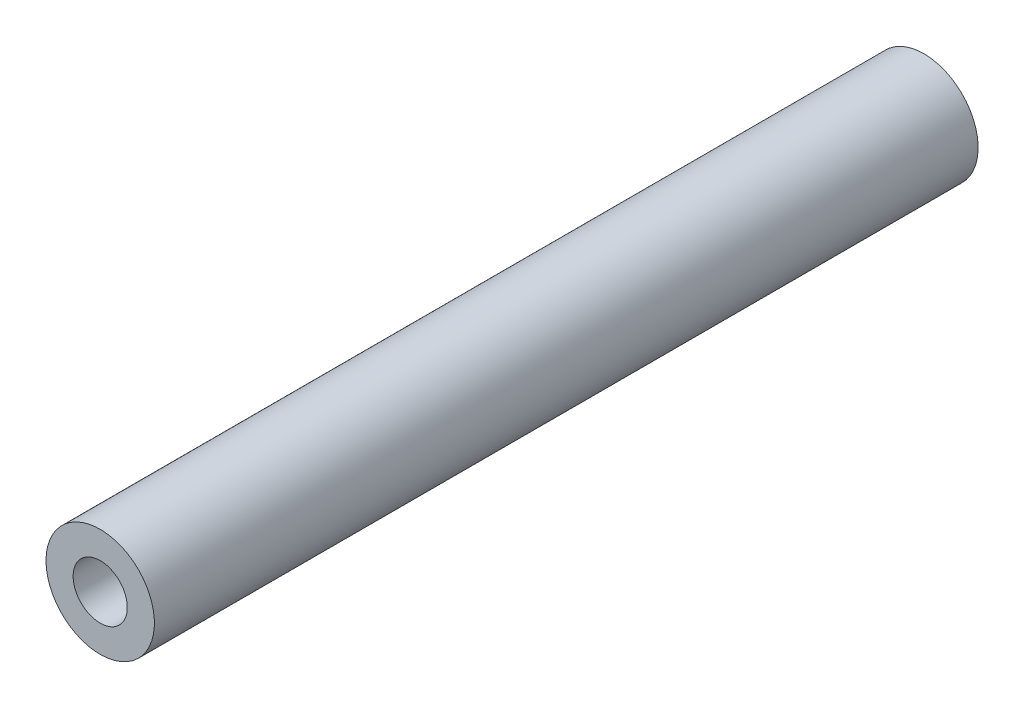
ISO-10303-21;
HEADER;
FILE_DESCRIPTION(('STEP AP214'),'2;1');
FILE_NAME('part.step','',(''),(''),'','','');
FILE_SCHEMA(('AUTOMOTIVE_DESIGN { 1 0 10303 214 1 1 1 1 }'));
ENDSEC;
DATA;
#1=APPLICATION_CONTEXT('core data for automotive mechanical design processes');
#2=APPLICATION_PROTOCOL_DEFINITION('international standard','automotive_design',2000,#1);
#3=PRODUCT_CONTEXT('',#1,'mechanical');
#4=PRODUCT('Part','Part','',(#3));
#5=PRODUCT_RELATED_PRODUCT_CATEGORY('part','',(#4));
#6=PRODUCT_DEFINITION_FORMATION('','',#4);
#7=PRODUCT_DEFINITION_CONTEXT('part definition',#1,'design');
#8=PRODUCT_DEFINITION('design','',#6,#7);
#9=PRODUCT_DEFINITION_SHAPE('','',#8);
#10=(LENGTH_UNIT() NAMED_UNIT(*) SI_UNIT(.MILLI.,.METRE.));
#11=(NAMED_UNIT(*) PLANE_ANGLE_UNIT() SI_UNIT($,.RADIAN.));
#12=(NAMED_UNIT(*) SI_UNIT($,.STERADIAN.) SOLID_ANGLE_UNIT());
#13=UNCERTAINTY_MEASURE_WITH_UNIT(LENGTH_MEASURE(1.E-05),#10,'distance_accuracy_value','');
#14=(GEOMETRIC_REPRESENTATION_CONTEXT(3) GLOBAL_UNCERTAINTY_ASSIGNED_CONTEXT((#13)) GLOBAL_UNIT_ASSIGNED_CONTEXT((#10,
#11,#12)) REPRESENTATION_CONTEXT('',''));
#15=CARTESIAN_POINT('',(0.,0.,0.));
#16=DIRECTION('',(0.,0.,1.));
#17=DIRECTION('',(1.,0.,0.));
#18=AXIS2_PLACEMENT_3D('',#15,#16,#17);
#19=CARTESIAN_POINT('',(0.,0.,96.52));
#20=DIRECTION('',(0.,0.,1.));
#21=DIRECTION('',(1.,0.,0.));
#22=AXIS2_PLACEMENT_3D('',#19,#20,#21);
#23=PLANE('',#22);
#24=CARTESIAN_POINT('',(0.,0.,96.52));
#25=DIRECTION('',(0.,0.,1.));
#26=DIRECTION('',(1.,0.,0.));
#27=AXIS2_PLACEMENT_3D('',#24,#25,#26);
#28=CIRCLE('',#27,6.35);
#29=CARTESIAN_POINT('',(-6.35,0.,96.52));
#30=VERTEX_POINT('',#29);
#31=EDGE_CURVE('E10',#30,#30,#28,.T.);
#32=ORIENTED_EDGE('',*,*,#31,.T.);
#33=EDGE_LOOP('',(#32));
#34=FACE_BOUND('',#33,.T.);
#35=CARTESIAN_POINT('',(0.,0.,96.52));
#36=DIRECTION('',(0.,0.,1.));
#37=DIRECTION('',(1.,0.,0.));
#38=AXIS2_PLACEMENT_3D('',#35,#36,#37);
#39=CIRCLE('',#38,3.175);
#40=CARTESIAN_POINT('',(-3.175,0.,96.52));
#41=VERTEX_POINT('',#40);
#42=EDGE_CURVE('E42',#41,#41,#39,.T.);
#43=ORIENTED_EDGE('',*,*,#42,.F.);
#44=EDGE_LOOP('',(#43));
#45=FACE_BOUND('',#44,.T.);
#46=ADVANCED_FACE('F31',(#34,#45),#23,.T.);
#47=CARTESIAN_POINT('',(0.,0.,0.));
#48=DIRECTION('',(0.,0.,1.));
#49=DIRECTION('',(1.,0.,0.));
#50=AXIS2_PLACEMENT_3D('',#47,#48,#49);
#51=PLANE('',#50);
#52=CARTESIAN_POINT('',(0.,0.,0.));
#53=DIRECTION('',(0.,0.,1.));
#54=DIRECTION('',(1.,0.,0.));
#55=AXIS2_PLACEMENT_3D('',#52,#53,#54);
#56=CIRCLE('',#55,6.35);
#57=CARTESIAN_POINT('',(-6.35,0.,0.));
#58=VERTEX_POINT('',#57);
#59=EDGE_CURVE('E35',#58,#58,#56,.T.);
#60=ORIENTED_EDGE('',*,*,#59,.F.);
#61=EDGE_LOOP('',(#60));
#62=FACE_BOUND('',#61,.T.);
#63=CARTESIAN_POINT('',(0.,0.,0.));
#64=DIRECTION('',(0.,0.,1.));
#65=DIRECTION('',(1.,0.,0.));
#66=AXIS2_PLACEMENT_3D('',#63,#64,#65);
#67=CIRCLE('',#66,3.175);
#68=CARTESIAN_POINT('',(-3.175,0.,0.));
#69=VERTEX_POINT('',#68);
#70=EDGE_CURVE('E44',#69,#69,#67,.T.);
#71=ORIENTED_EDGE('',*,*,#70,.T.);
#72=EDGE_LOOP('',(#71));
#73=FACE_BOUND('',#72,.T.);
#74=ADVANCED_FACE('F54',(#62,#73),#51,.F.);
#75=CARTESIAN_POINT('',(0.,0.,96.52));
#76=DIRECTION('',(0.,0.,-1.));
#77=DIRECTION('',(-1.,0.,0.));
#78=AXIS2_PLACEMENT_3D('',#75,#76,#77);
#79=CYLINDRICAL_SURFACE('',#78,6.35);
#80=CARTESIAN_POINT('',(-6.35,0.,96.52));
#81=CARTESIAN_POINT('',(-6.35,0.,95.5145833333333));
#82=CARTESIAN_POINT('',(-6.35,0.,94.5091666666666));
#83=CARTESIAN_POINT('',(-6.35,0.,92.4983333333333));
#84=CARTESIAN_POINT('',(-6.35,0.,91.4929166666666));
#85=CARTESIAN_POINT('',(-6.35,0.,89.4820833333333));
#86=CARTESIAN_POINT('',(-6.35,0.,88.4766666666666));
#87=CARTESIAN_POINT('',(-6.35,0.,86.4658333333333));
#88=CARTESIAN_POINT('',(-6.35,0.,85.4604166666666));
#89=CARTESIAN_POINT('',(-6.35,0.,83.4495833333333));
#90=CARTESIAN_POINT('',(-6.35,0.,82.4441666666666));
#91=CARTESIAN_POINT('',(-6.35,0.,80.4333333333333));
#92=CARTESIAN_POINT('',(-6.35,0.,79.4279166666666));
#93=CARTESIAN_POINT('',(-6.35,0.,77.4170833333333));
#94=CARTESIAN_POINT('',(-6.35,0.,76.4116666666667));
#95=CARTESIAN_POINT('',(-6.35,0.,74.4008333333333));
#96=CARTESIAN_POINT('',(-6.35,0.,73.3954166666667));
#97=CARTESIAN_POINT('',(-6.35,0.,71.3845833333333));
#98=CARTESIAN_POINT('',(-6.35,0.,70.3791666666666));
#99=CARTESIAN_POINT('',(-6.35,0.,68.3683333333333));
#100=CARTESIAN_POINT('',(-6.35,0.,67.3629166666666));
#101=CARTESIAN_POINT('',(-6.35,0.,65.3520833333333));
#102=CARTESIAN_POINT('',(-6.35,0.,64.3466666666666));
#103=CARTESIAN_POINT('',(-6.35,0.,62.3358333333333));
#104=CARTESIAN_POINT('',(-6.35,0.,61.3304166666667));
#105=CARTESIAN_POINT('',(-6.35,0.,59.3195833333333));
#106=CARTESIAN_POINT('',(-6.35,0.,58.3141666666667));
#107=CARTESIAN_POINT('',(-6.35,0.,56.3033333333333));
#108=CARTESIAN_POINT('',(-6.35,0.,55.2979166666667));
#109=CARTESIAN_POINT('',(-6.35,0.,53.2870833333333));
#110=CARTESIAN_POINT('',(-6.35,0.,52.2816666666667));
#111=CARTESIAN_POINT('',(-6.35,0.,50.2708333333333));
#112=CARTESIAN_POINT('',(-6.35,0.,49.2654166666667));
#113=CARTESIAN_POINT('',(-6.35,0.,47.2545833333333));
#114=CARTESIAN_POINT('',(-6.35,0.,46.2491666666667));
#115=CARTESIAN_POINT('',(-6.35,0.,44.2383333333333));
#116=CARTESIAN_POINT('',(-6.35,0.,43.2329166666667));
#117=CARTESIAN_POINT('',(-6.35,0.,41.2220833333333));
#118=CARTESIAN_POINT('',(-6.35,0.,40.2166666666667));
#119=CARTESIAN_POINT('',(-6.35,0.,38.2058333333333));
#120=CARTESIAN_POINT('',(-6.35,0.,37.2004166666667));
#121=CARTESIAN_POINT('',(-6.35,0.,35.1895833333333));
#122=CARTESIAN_POINT('',(-6.35,0.,34.1841666666667));
#123=CARTESIAN_POINT('',(-6.35,0.,32.1733333333333));
#124=CARTESIAN_POINT('',(-6.35,0.,31.1679166666667));
#125=CARTESIAN_POINT('',(-6.35,0.,29.1570833333333));
#126=CARTESIAN_POINT('',(-6.35,0.,28.1516666666667));
#127=CARTESIAN_POINT('',(-6.35,0.,26.1408333333333));
#128=CARTESIAN_POINT('',(-6.35,0.,25.1354166666667));
#129=CARTESIAN_POINT('',(-6.35,0.,23.1245833333333));
#130=CARTESIAN_POINT('',(-6.35,0.,22.1191666666667));
#131=CARTESIAN_POINT('',(-6.35,0.,20.1083333333333));
#132=CARTESIAN_POINT('',(-6.35,0.,19.1029166666667));
#133=CARTESIAN_POINT('',(-6.35,0.,17.0920833333333));
#134=CARTESIAN_POINT('',(-6.35,0.,16.0866666666667));
#135=CARTESIAN_POINT('',(-6.35,0.,14.0758333333333));
#136=CARTESIAN_POINT('',(-6.35,0.,13.0704166666667));
#137=CARTESIAN_POINT('',(-6.35,0.,11.0595833333333));
#138=CARTESIAN_POINT('',(-6.35,0.,10.0541666666667));
#139=CARTESIAN_POINT('',(-6.35,0.,8.04333333333331));
#140=CARTESIAN_POINT('',(-6.35,0.,7.03791666666665));
#141=CARTESIAN_POINT('',(-6.35,0.,5.02708333333332));
#142=CARTESIAN_POINT('',(-6.35,0.,4.02166666666665));
#143=CARTESIAN_POINT('',(-6.35,0.,2.01083333333332));
#144=CARTESIAN_POINT('',(-6.35,0.,1.00541666666665));
#145=CARTESIAN_POINT('',(-6.35,0.,0.));
#146=B_SPLINE_CURVE_WITH_KNOTS('',3,(#80,#81,#82,#83,#84,#85,#86,#87,#88,#89,#90,#91,#92,#93,
#94,#95,#96,#97,#98,#99,#100,#101,#102,#103,#104,#105,#106,#107,#108,#109,#110,#111,#112,#113,
#114,#115,#116,#117,#118,#119,#120,#121,#122,#123,#124,#125,#126,#127,#128,#129,#130,#131,#132,
#133,#134,#135,#136,#137,#138,#139,#140,#141,#142,#143,#144,#145),.UNSPECIFIED.,.F.,.F.,(4,2,2,
2,2,2,2,2,2,2,2,2,2,2,2,2,2,2,2,2,2,2,2,2,2,2,2,2,2,2,2,2,4),(0.,3.01625,6.0325,
9.04874999999999,12.065,15.08125,18.0975,21.11375,24.13,27.14625,30.1625,33.17875,36.195,
39.21125,42.2275,45.24375,48.26,51.27625,54.2925,57.30875,60.325,63.34125,66.3575,69.37375,
72.39,75.40625,78.4225,81.43875,84.455,87.47125,90.4875,93.50375,96.52),.UNSPECIFIED.);
#147=EDGE_CURVE('BSEAM33',#30,#58,#146,.T.);
#148=ORIENTED_EDGE('',*,*,#31,.F.);
#149=ORIENTED_EDGE('',*,*,#59,.T.);
#150=ORIENTED_EDGE('',*,*,#147,.T.);
#151=ORIENTED_EDGE('',*,*,#147,.F.);
#152=EDGE_LOOP('',(#148,#150,#149,#151));
#153=FACE_BOUND('',#152,.T.);
#154=ADVANCED_FACE('F33',(#153),#79,.T.);
#155=CARTESIAN_POINT('',(0.,0.,96.52));
#156=DIRECTION('',(0.,0.,-1.));
#157=DIRECTION('',(-1.,0.,0.));
#158=AXIS2_PLACEMENT_3D('',#155,#156,#157);
#159=CYLINDRICAL_SURFACE('',#158,3.175);
#160=CARTESIAN_POINT('',(-3.175,0.,96.52));
#161=CARTESIAN_POINT('',(-3.175,0.,95.5145833333333));
#162=CARTESIAN_POINT('',(-3.175,0.,94.5091666666667));
#163=CARTESIAN_POINT('',(-3.175,0.,92.4983333333333));
#164=CARTESIAN_POINT('',(-3.175,0.,91.4929166666666));
#165=CARTESIAN_POINT('',(-3.175,0.,89.4820833333333));
#166=CARTESIAN_POINT('',(-3.175,0.,88.4766666666666));
#167=CARTESIAN_POINT('',(-3.175,0.,86.4658333333333));
#168=CARTESIAN_POINT('',(-3.175,0.,85.4604166666666));
#169=CARTESIAN_POINT('',(-3.175,0.,83.4495833333333));
#170=CARTESIAN_POINT('',(-3.175,0.,82.4441666666666));
#171=CARTESIAN_POINT('',(-3.175,0.,80.4333333333333));
#172=CARTESIAN_POINT('',(-3.175,0.,79.4279166666666));
#173=CARTESIAN_POINT('',(-3.175,0.,77.4170833333333));
#174=CARTESIAN_POINT('',(-3.175,0.,76.4116666666667));
#175=CARTESIAN_POINT('',(-3.175,0.,74.4008333333333));
#176=CARTESIAN_POINT('',(-3.175,0.,73.3954166666666));
#177=CARTESIAN_POINT('',(-3.175,0.,71.3845833333333));
#178=CARTESIAN_POINT('',(-3.175,0.,70.3791666666666));
#179=CARTESIAN_POINT('',(-3.175,0.,68.3683333333333));
#180=CARTESIAN_POINT('',(-3.175,0.,67.3629166666666));
#181=CARTESIAN_POINT('',(-3.175,0.,65.3520833333333));
#182=CARTESIAN_POINT('',(-3.175,0.,64.3466666666666));
#183=CARTESIAN_POINT('',(-3.175,0.,62.3358333333333));
#184=CARTESIAN_POINT('',(-3.175,0.,61.3304166666667));
#185=CARTESIAN_POINT('',(-3.175,0.,59.3195833333333));
#186=CARTESIAN_POINT('',(-3.175,0.,58.3141666666667));
#187=CARTESIAN_POINT('',(-3.175,0.,56.3033333333333));
#188=CARTESIAN_POINT('',(-3.175,0.,55.2979166666667));
#189=CARTESIAN_POINT('',(-3.175,0.,53.2870833333333));
#190=CARTESIAN_POINT('',(-3.175,0.,52.2816666666667));
#191=CARTESIAN_POINT('',(-3.175,0.,50.2708333333333));
#192=CARTESIAN_POINT('',(-3.175,0.,49.2654166666667));
#193=CARTESIAN_POINT('',(-3.175,0.,47.2545833333333));
#194=CARTESIAN_POINT('',(-3.175,0.,46.2491666666667));
#195=CARTESIAN_POINT('',(-3.175,0.,44.2383333333333));
#196=CARTESIAN_POINT('',(-3.175,0.,43.2329166666666));
#197=CARTESIAN_POINT('',(-3.175,0.,41.2220833333333));
#198=CARTESIAN_POINT('',(-3.175,0.,40.2166666666666));
#199=CARTESIAN_POINT('',(-3.175,0.,38.2058333333333));
#200=CARTESIAN_POINT('',(-3.175,0.,37.2004166666666));
#201=CARTESIAN_POINT('',(-3.175,0.,35.1895833333333));
#202=CARTESIAN_POINT('',(-3.175,0.,34.1841666666667));
#203=CARTESIAN_POINT('',(-3.175,0.,32.1733333333333));
#204=CARTESIAN_POINT('',(-3.175,0.,31.1679166666667));
#205=CARTESIAN_POINT('',(-3.175,0.,29.1570833333333));
#206=CARTESIAN_POINT('',(-3.175,0.,28.1516666666667));
#207=CARTESIAN_POINT('',(-3.175,0.,26.1408333333333));
#208=CARTESIAN_POINT('',(-3.175,0.,25.1354166666667));
#209=CARTESIAN_POINT('',(-3.175,0.,23.1245833333333));
#210=CARTESIAN_POINT('',(-3.175,0.,22.1191666666667));
#211=CARTESIAN_POINT('',(-3.175,0.,20.1083333333333));
#212=CARTESIAN_POINT('',(-3.175,0.,19.1029166666667));
#213=CARTESIAN_POINT('',(-3.175,0.,17.0920833333333));
#214=CARTESIAN_POINT('',(-3.175,0.,16.0866666666667));
#215=CARTESIAN_POINT('',(-3.175,0.,14.0758333333333));
#216=CARTESIAN_POINT('',(-3.175,0.,13.0704166666667));
#217=CARTESIAN_POINT('',(-3.175,0.,11.0595833333333));
#218=CARTESIAN_POINT('',(-3.175,0.,10.0541666666667));
#219=CARTESIAN_POINT('',(-3.175,0.,8.04333333333332));
#220=CARTESIAN_POINT('',(-3.175,0.,7.03791666666665));
#221=CARTESIAN_POINT('',(-3.175,0.,5.02708333333332));
#222=CARTESIAN_POINT('',(-3.175,0.,4.02166666666665));
#223=CARTESIAN_POINT('',(-3.175,0.,2.01083333333332));
#224=CARTESIAN_POINT('',(-3.175,0.,1.00541666666665));
#225=CARTESIAN_POINT('',(-3.175,0.,0.));
#226=B_SPLINE_CURVE_WITH_KNOTS('',3,(#160,#161,#162,#163,#164,#165,#166,#167,#168,#169,#170,
#171,#172,#173,#174,#175,#176,#177,#178,#179,#180,#181,#182,#183,#184,#185,#186,#187,#188,#189,
#190,#191,#192,#193,#194,#195,#196,#197,#198,#199,#200,#201,#202,#203,#204,#205,#206,#207,#208,
#209,#210,#211,#212,#213,#214,#215,#216,#217,#218,#219,#220,#221,#222,#223,#224,#225),
.UNSPECIFIED.,.F.,.F.,(4,2,2,2,2,2,2,2,2,2,2,2,2,2,2,2,2,2,2,2,2,2,2,2,2,2,2,2,2,2,2,2,4),(0.,
3.01625000000001,6.03250000000001,9.04875000000001,12.065,15.08125,18.0975,21.11375,24.13,
27.14625,30.1625,33.17875,36.195,39.21125,42.2275,45.24375,48.26,51.27625,54.2925,57.30875,
60.325,63.34125,66.3575,69.37375,72.39,75.40625,78.4225,81.43875,84.455,87.47125,90.4875,
93.50375,96.52),.UNSPECIFIED.);
#227=EDGE_CURVE('BSEAM50',#41,#69,#226,.T.);
#228=ORIENTED_EDGE('',*,*,#42,.T.);
#229=ORIENTED_EDGE('',*,*,#70,.F.);
#230=ORIENTED_EDGE('',*,*,#227,.T.);
#231=ORIENTED_EDGE('',*,*,#227,.F.);
#232=EDGE_LOOP('',(#228,#230,#229,#231));
#233=FACE_BOUND('',#232,.T.);
#234=ADVANCED_FACE('F50',(#233),#159,.F.);
#235=CLOSED_SHELL('',(#46,#74,#154,#234));
#236=MANIFOLD_SOLID_BREP('B2',#235);
#237=ADVANCED_BREP_SHAPE_REPRESENTATION('',(#18,#236),#14);
#238=SHAPE_DEFINITION_REPRESENTATION(#9,#237);
ENDSEC;
END-ISO-10303-21;
